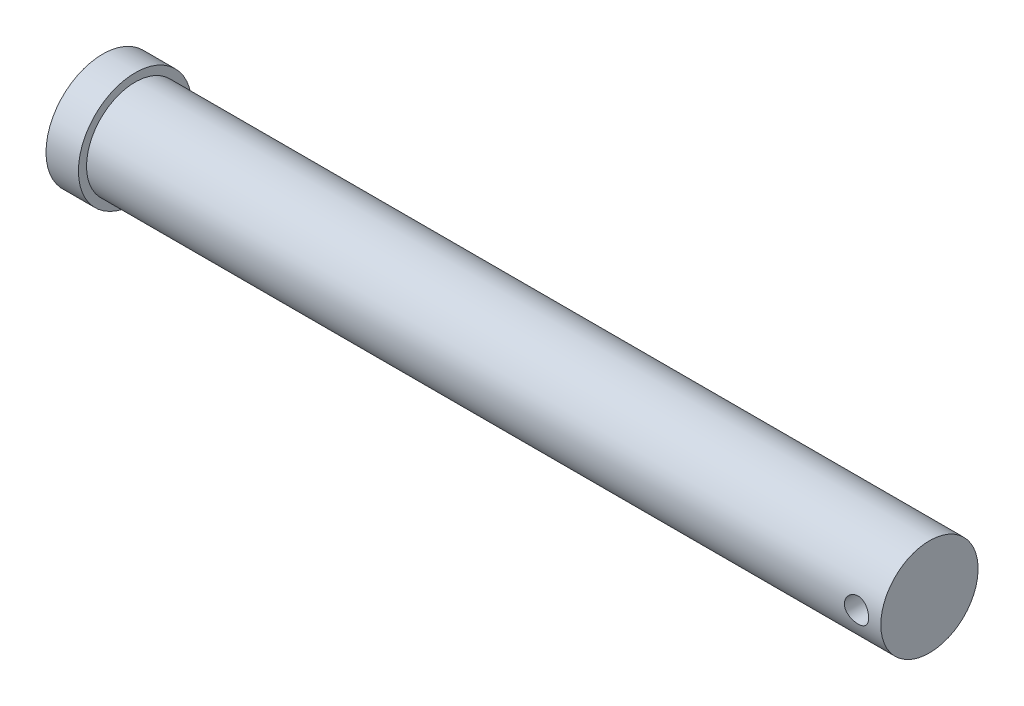
ISO-10303-21;
HEADER;
FILE_DESCRIPTION(('STEP AP214'),'2;1');
FILE_NAME('part.step','',(''),(''),'','','');
FILE_SCHEMA(('AUTOMOTIVE_DESIGN { 1 0 10303 214 1 1 1 1 }'));
ENDSEC;
DATA;
#1=APPLICATION_CONTEXT('core data for automotive mechanical design processes');
#2=APPLICATION_PROTOCOL_DEFINITION('international standard','automotive_design',2000,#1);
#3=PRODUCT_CONTEXT('',#1,'mechanical');
#4=PRODUCT('Part','Part','',(#3));
#5=PRODUCT_RELATED_PRODUCT_CATEGORY('part','',(#4));
#6=PRODUCT_DEFINITION_FORMATION('','',#4);
#7=PRODUCT_DEFINITION_CONTEXT('part definition',#1,'design');
#8=PRODUCT_DEFINITION('design','',#6,#7);
#9=PRODUCT_DEFINITION_SHAPE('','',#8);
#10=(LENGTH_UNIT() NAMED_UNIT(*) SI_UNIT(.MILLI.,.METRE.));
#11=(NAMED_UNIT(*) PLANE_ANGLE_UNIT() SI_UNIT($,.RADIAN.));
#12=(NAMED_UNIT(*) SI_UNIT($,.STERADIAN.) SOLID_ANGLE_UNIT());
#13=UNCERTAINTY_MEASURE_WITH_UNIT(LENGTH_MEASURE(1.E-05),#10,'distance_accuracy_value','');
#14=(GEOMETRIC_REPRESENTATION_CONTEXT(3) GLOBAL_UNCERTAINTY_ASSIGNED_CONTEXT((#13)) GLOBAL_UNIT_ASSIGNED_CONTEXT((#10,
#11,#12)) REPRESENTATION_CONTEXT('',''));
#15=CARTESIAN_POINT('',(0.,0.,0.));
#16=DIRECTION('',(0.,0.,1.));
#17=DIRECTION('',(1.,0.,0.));
#18=AXIS2_PLACEMENT_3D('',#15,#16,#17);
#19=CARTESIAN_POINT('',(0.,0.,0.));
#20=DIRECTION('',(1.,0.,0.));
#21=DIRECTION('',(0.,0.,-1.));
#22=AXIS2_PLACEMENT_3D('',#19,#20,#21);
#23=PLANE('',#22);
#24=CARTESIAN_POINT('',(0.,0.,0.));
#25=DIRECTION('',(-1.,0.,0.));
#26=DIRECTION('',(0.,0.,1.));
#27=AXIS2_PLACEMENT_3D('',#24,#25,#26);
#28=CIRCLE('',#27,35.);
#29=CARTESIAN_POINT('',(0.,0.,35.));
#30=VERTEX_POINT('',#29);
#31=EDGE_CURVE('E45',#30,#30,#28,.T.);
#32=ORIENTED_EDGE('',*,*,#31,.T.);
#33=EDGE_LOOP('',(#32));
#34=FACE_BOUND('',#33,.T.);
#35=ADVANCED_FACE('F31',(#34),#23,.F.);
#36=CARTESIAN_POINT('',(0.,0.,0.));
#37=DIRECTION('',(-1.,0.,0.));
#38=DIRECTION('',(0.,0.,1.));
#39=AXIS2_PLACEMENT_3D('',#36,#37,#38);
#40=CYLINDRICAL_SURFACE('',#39,35.);
#41=ORIENTED_EDGE('',*,*,#31,.F.);
#42=EDGE_LOOP('',(#41));
#43=FACE_BOUND('',#42,.T.);
#44=CARTESIAN_POINT('',(20.,0.,0.));
#45=DIRECTION('',(-1.,0.,0.));
#46=DIRECTION('',(0.,0.,1.));
#47=AXIS2_PLACEMENT_3D('',#44,#45,#46);
#48=CIRCLE('',#47,35.);
#49=CARTESIAN_POINT('',(20.,0.,35.));
#50=VERTEX_POINT('',#49);
#51=EDGE_CURVE('E49',#50,#50,#48,.T.);
#52=ORIENTED_EDGE('',*,*,#51,.T.);
#53=EDGE_LOOP('',(#52));
#54=FACE_BOUND('',#53,.T.);
#55=ADVANCED_FACE('F72',(#43,#54),#40,.T.);
#56=CARTESIAN_POINT('',(20.,35.,0.));
#57=DIRECTION('',(-1.,0.,0.));
#58=DIRECTION('',(0.,0.,1.));
#59=AXIS2_PLACEMENT_3D('',#56,#57,#58);
#60=PLANE('',#59);
#61=ORIENTED_EDGE('',*,*,#51,.F.);
#62=EDGE_LOOP('',(#61));
#63=FACE_BOUND('',#62,.T.);
#64=CARTESIAN_POINT('',(20.,0.,0.));
#65=DIRECTION('',(-1.,0.,0.));
#66=DIRECTION('',(0.,0.,1.));
#67=AXIS2_PLACEMENT_3D('',#64,#65,#66);
#68=CIRCLE('',#67,30.);
#69=CARTESIAN_POINT('',(20.,0.,30.));
#70=VERTEX_POINT('',#69);
#71=EDGE_CURVE('E83',#70,#70,#68,.T.);
#72=ORIENTED_EDGE('',*,*,#71,.T.);
#73=EDGE_LOOP('',(#72));
#74=FACE_BOUND('',#73,.T.);
#75=ADVANCED_FACE('F69',(#63,#74),#60,.F.);
#76=CARTESIAN_POINT('',(0.,0.,0.));
#77=DIRECTION('',(-1.,0.,0.));
#78=DIRECTION('',(0.,0.,1.));
#79=AXIS2_PLACEMENT_3D('',#76,#77,#78);
#80=CYLINDRICAL_SURFACE('',#79,30.);
#81=CARTESIAN_POINT('',(502.5,0.,-30.));
#82=CARTESIAN_POINT('',(502.500006186217,0.207256734254569,-30.0000037453459));
#83=CARTESIAN_POINT('',(502.491407656385,0.414445772619024,-29.9978490421554));
#84=CARTESIAN_POINT('',(502.457100172479,0.827372926875361,-29.9892986338407));
#85=CARTESIAN_POINT('',(502.431389266198,1.0331108745179,-29.9829024448411));
#86=CARTESIAN_POINT('',(502.36305535088,1.44164335288552,-29.9660390935064));
#87=CARTESIAN_POINT('',(502.320427095302,1.64443695024208,-29.9555706682773));
#88=CARTESIAN_POINT('',(502.218595090544,2.04566249050754,-29.9308482104685));
#89=CARTESIAN_POINT('',(502.159385232191,2.24409279672969,-29.9165927827403));
#90=CARTESIAN_POINT('',(502.024978510783,2.63482361033415,-29.8847130121074));
#91=CARTESIAN_POINT('',(501.949807291118,2.82713338772062,-29.8670940775137));
#92=CARTESIAN_POINT('',(501.783968260347,3.20473275040715,-29.8289408904844));
#93=CARTESIAN_POINT('',(501.693294723877,3.3900197110199,-29.8084055614329));
#94=CARTESIAN_POINT('',(501.497171832667,3.75222027556638,-29.7649811811595));
#95=CARTESIAN_POINT('',(501.391727896133,3.92913691827912,-29.742092993849));
#96=CARTESIAN_POINT('',(501.166735936979,4.27360568159018,-29.6945540671174));
#97=CARTESIAN_POINT('',(501.047182537647,4.44115419618479,-29.6699026572012));
#98=CARTESIAN_POINT('',(500.792523081933,4.76869838853694,-29.619039181262));
#99=CARTESIAN_POINT('',(500.657174907785,4.92850273427091,-29.5928069564233));
#100=CARTESIAN_POINT('',(500.373571351916,5.23627158512012,-29.5399027992388));
#101=CARTESIAN_POINT('',(500.225310108958,5.38423065457479,-29.5132306717209));
#102=CARTESIAN_POINT('',(499.916888160703,5.66727667516594,-29.4601886439759));
#103=CARTESIAN_POINT('',(499.756726097412,5.80236215327956,-29.4338187786372));
#104=CARTESIAN_POINT('',(499.425632772002,6.05867850940967,-29.3821290110363));
#105=CARTESIAN_POINT('',(499.254706399365,6.17991560837026,-29.3568086406046));
#106=CARTESIAN_POINT('',(498.900431237845,6.40951409930148,-29.3075439341613));
#107=CARTESIAN_POINT('',(498.716932176899,6.51764960185275,-29.2836266449605));
#108=CARTESIAN_POINT('',(498.341230118986,6.71799715274028,-29.2383150093389));
#109=CARTESIAN_POINT('',(498.149030545994,6.810215397515,-29.2169196821753));
#110=CARTESIAN_POINT('',(497.757145068966,6.97807998690051,-29.177283030045));
#111=CARTESIAN_POINT('',(497.557457135497,7.05372180053078,-29.1590425677113));
#112=CARTESIAN_POINT('',(497.152161449931,7.18774907819534,-29.1262944152227));
#113=CARTESIAN_POINT('',(496.946556194448,7.24614170611678,-29.111785175751));
#114=CARTESIAN_POINT('',(496.534958657447,7.34423429783442,-29.087191868454));
#115=CARTESIAN_POINT('',(496.329053396646,7.38427907774644,-29.0770264361312));
#116=CARTESIAN_POINT('',(495.914524296797,7.44698381998098,-29.0610302983691));
#117=CARTESIAN_POINT('',(495.705901540208,7.46965050140465,-29.0551979176174));
#118=CARTESIAN_POINT('',(495.287403528923,7.49742486553874,-29.0480434288025));
#119=CARTESIAN_POINT('',(495.077528217797,7.50253175108477,-29.0467215255021));
#120=CARTESIAN_POINT('',(494.658110384037,7.49513850303133,-29.0486301556068));
#121=CARTESIAN_POINT('',(494.448567856817,7.48263861425256,-29.0518606257116));
#122=CARTESIAN_POINT('',(494.036489209476,7.44066443989567,-29.062638653717));
#123=CARTESIAN_POINT('',(493.833907059313,7.41161271353984,-29.0700787116682));
#124=CARTESIAN_POINT('',(493.431905166734,7.33708950806219,-29.0889771849314));
#125=CARTESIAN_POINT('',(493.232486535232,7.29161238858812,-29.1004369805509));
#126=CARTESIAN_POINT('',(492.838319690164,7.18462456321617,-29.1270356051468));
#127=CARTESIAN_POINT('',(492.643570038699,7.12311886472073,-29.1421732850352));
#128=CARTESIAN_POINT('',(492.259908488116,6.98451980658922,-29.1757016001342));
#129=CARTESIAN_POINT('',(492.070998807608,6.90742060486369,-29.1940934541936));
#130=CARTESIAN_POINT('',(491.69851839304,6.73739848582145,-29.2338015327733));
#131=CARTESIAN_POINT('',(491.515017414975,6.64432902465882,-29.2551444484012));
#132=CARTESIAN_POINT('',(491.156419006921,6.4435338982084,-29.3000247863839));
#133=CARTESIAN_POINT('',(490.981324498637,6.33580318651128,-29.3235629634671));
#134=CARTESIAN_POINT('',(490.640714884194,6.10645448231129,-29.3721798477543));
#135=CARTESIAN_POINT('',(490.475199544114,5.98483682913724,-29.3972585173093));
#136=CARTESIAN_POINT('',(490.154773921606,5.72851464458553,-29.4482799478748));
#137=CARTESIAN_POINT('',(489.999863844413,5.59380986006427,-29.4742227255933));
#138=CARTESIAN_POINT('',(489.697330574703,5.30812720402326,-29.527029674638));
#139=CARTESIAN_POINT('',(489.550044476872,5.15679305825275,-29.5538989083984));
#140=CARTESIAN_POINT('',(489.268755446213,4.8422451377085,-29.6070614891839));
#141=CARTESIAN_POINT('',(489.134748122933,4.67903532063268,-29.6333550243011));
#142=CARTESIAN_POINT('',(488.88082948277,4.3416974590044,-29.6846555639648));
#143=CARTESIAN_POINT('',(488.760923905518,4.16756501268226,-29.7096620423464));
#144=CARTESIAN_POINT('',(488.536173056712,3.80966849400532,-29.7576713903058));
#145=CARTESIAN_POINT('',(488.431321967214,3.62590818010498,-29.7806750325378));
#146=CARTESIAN_POINT('',(488.237034272838,3.2492118412492,-29.8241295151946));
#147=CARTESIAN_POINT('',(488.147658542865,3.05624322556206,-29.8445701905708));
#148=CARTESIAN_POINT('',(487.985552498738,2.66321164273131,-29.8822063507743));
#149=CARTESIAN_POINT('',(487.912816015972,2.46315133653774,-29.8994030378182));
#150=CARTESIAN_POINT('',(487.784544100766,2.0573013366979,-29.9300671893901));
#151=CARTESIAN_POINT('',(487.729009232108,1.85151145550618,-29.9435345316877));
#152=CARTESIAN_POINT('',(487.635622134414,1.4357343464327,-29.9663479171876));
#153=CARTESIAN_POINT('',(487.597769469432,1.22574722216531,-29.9756940619961));
#154=CARTESIAN_POINT('',(487.540819163691,0.808578683807327,-29.9898089145492));
#155=CARTESIAN_POINT('',(487.521266127366,0.60146309569843,-29.9946886976466));
#156=CARTESIAN_POINT('',(487.499432162322,0.186267995157742,-30.0001400772457));
#157=CARTESIAN_POINT('',(487.497150960436,-0.0218115019769316,-30.000711741884));
#158=CARTESIAN_POINT('',(487.50987953381,-0.437389325214058,-29.9975310207239));
#159=CARTESIAN_POINT('',(487.524887864681,-0.644887698412771,-29.9937789961322));
#160=CARTESIAN_POINT('',(487.572063941794,-1.0578026849136,-29.9820565166686));
#161=CARTESIAN_POINT('',(487.604231620946,-1.26321930635197,-29.9740860782903));
#162=CARTESIAN_POINT('',(487.684842366611,-1.66742320422337,-29.9542990466074));
#163=CARTESIAN_POINT('',(487.733033584068,-1.86626371494319,-29.9425420528386));
#164=CARTESIAN_POINT('',(487.845432070167,-2.25918742632006,-29.9154620308896));
#165=CARTESIAN_POINT('',(487.909644760804,-2.45326899198188,-29.9001377955995));
#166=CARTESIAN_POINT('',(488.05356225007,-2.83525089394271,-29.8663374011303));
#167=CARTESIAN_POINT('',(488.133262697368,-3.02315294909718,-29.8478621274231));
#168=CARTESIAN_POINT('',(488.307610064188,-3.39167896910059,-29.8082350586212));
#169=CARTESIAN_POINT('',(488.402262583514,-3.57230017520983,-29.7870822613409));
#170=CARTESIAN_POINT('',(488.607595070583,-3.92811410360476,-29.7422701230095));
#171=CARTESIAN_POINT('',(488.718525064136,-4.10315786453241,-29.7185735994032));
#172=CARTESIAN_POINT('',(488.954405866344,-4.44338343365204,-29.6696123625192));
#173=CARTESIAN_POINT('',(489.07936153279,-4.60856179442648,-29.6443471072734));
#174=CARTESIAN_POINT('',(489.342420940197,-4.92794065130356,-29.5929310301235));
#175=CARTESIAN_POINT('',(489.480524460526,-5.08214133154534,-29.5667802230845));
#176=CARTESIAN_POINT('',(489.76898239741,-5.37858986672455,-29.5142920657744));
#177=CARTESIAN_POINT('',(489.919336952682,-5.52083758628273,-29.4879547133943));
#178=CARTESIAN_POINT('',(490.235205576479,-5.79583124003956,-29.4351563606738));
#179=CARTESIAN_POINT('',(490.401002867936,-5.92825459803294,-29.4087084526847));
#180=CARTESIAN_POINT('',(490.74329399094,-6.17862451598171,-29.3571275246933));
#181=CARTESIAN_POINT('',(490.919784122681,-6.29657604105008,-29.3319940554304));
#182=CARTESIAN_POINT('',(491.282397387657,-6.51724566861912,-29.2837544538572));
#183=CARTESIAN_POINT('',(491.468523885388,-6.61995840151202,-29.2606490373261));
#184=CARTESIAN_POINT('',(491.849007741884,-6.80928641924748,-29.2171705487862));
#185=CARTESIAN_POINT('',(492.043361767825,-6.89590814708459,-29.1967963840713));
#186=CARTESIAN_POINT('',(492.437897915295,-7.05197723932844,-29.1594928518965));
#187=CARTESIAN_POINT('',(492.638041174236,-7.12151832737368,-29.142544780169));
#188=CARTESIAN_POINT('',(493.043683954083,-7.24345651216673,-29.1124764442986));
#189=CARTESIAN_POINT('',(493.249181379846,-7.29586020933082,-29.0993547066657));
#190=CARTESIAN_POINT('',(493.664097517061,-7.38310953761375,-29.0773403452909));
#191=CARTESIAN_POINT('',(493.873516262,-7.41795501871779,-29.0684477576821));
#192=CARTESIAN_POINT('',(494.294693502206,-7.4697763239746,-29.0551744235845));
#193=CARTESIAN_POINT('',(494.506451941057,-7.48675257805301,-29.0507935685455));
#194=CARTESIAN_POINT('',(494.924548037895,-7.50245275501602,-29.0467427280978));
#195=CARTESIAN_POINT('',(495.130865291879,-7.50169050219213,-29.0469401256905));
#196=CARTESIAN_POINT('',(495.542757585411,-7.48317627143562,-29.0517153474307));
#197=CARTESIAN_POINT('',(495.748332344452,-7.46541843430732,-29.0562946822425));
#198=CARTESIAN_POINT('',(496.157102212016,-7.41306667528962,-29.0696950370366));
#199=CARTESIAN_POINT('',(496.360298223325,-7.3784793676475,-29.0785143906083));
#200=CARTESIAN_POINT('',(496.763027411306,-7.29274542738176,-29.1001342961677));
#201=CARTESIAN_POINT('',(496.962559195749,-7.24159263281373,-29.1129363295422));
#202=CARTESIAN_POINT('',(497.355248099114,-7.12352281554539,-29.1420502241293));
#203=CARTESIAN_POINT('',(497.548437627675,-7.05670785633585,-29.1583393045388));
#204=CARTESIAN_POINT('',(497.928538990651,-6.90762983393251,-29.1940151713161));
#205=CARTESIAN_POINT('',(498.115448654799,-6.82536149362091,-29.2134030155311));
#206=CARTESIAN_POINT('',(498.481700975957,-6.64600134575058,-29.2547283332099));
#207=CARTESIAN_POINT('',(498.66104416923,-6.54891059096665,-29.2766656255706));
#208=CARTESIAN_POINT('',(499.011053726098,-6.34057791264127,-29.3224903932774));
#209=CARTESIAN_POINT('',(499.181719851362,-6.22933560069453,-29.3463779221434));
#210=CARTESIAN_POINT('',(499.517676511658,-5.99034243964048,-29.3961065190916));
#211=CARTESIAN_POINT('',(499.682708134733,-5.8622347432516,-29.42198241748));
#212=CARTESIAN_POINT('',(500.001403053256,-5.5928073999301,-29.4743842744133));
#213=CARTESIAN_POINT('',(500.155069946792,-5.45149196693626,-29.5009100236431));
#214=CARTESIAN_POINT('',(500.450186022067,-5.15645532971087,-29.5539073425417));
#215=CARTESIAN_POINT('',(500.591628075764,-5.00272698747195,-29.580378871931));
#216=CARTESIAN_POINT('',(500.861210696173,-4.68398990056894,-29.6325210396486));
#217=CARTESIAN_POINT('',(500.989356069046,-4.51898526780466,-29.6581919649966));
#218=CARTESIAN_POINT('',(501.233778989682,-4.17555233782094,-29.7085076706245));
#219=CARTESIAN_POINT('',(501.349792570839,-3.99693193174415,-29.7331246154161));
#220=CARTESIAN_POINT('',(501.566283371818,-3.63032066972448,-29.7801093561847));
#221=CARTESIAN_POINT('',(501.666766303198,-3.44233329237775,-29.8024779779427));
#222=CARTESIAN_POINT('',(501.851436858964,-3.05829616105561,-29.8443309638024));
#223=CARTESIAN_POINT('',(501.935631507769,-2.86224992693626,-29.8638165703652));
#224=CARTESIAN_POINT('',(502.087082944362,-2.46348752288621,-29.8993536986122));
#225=CARTESIAN_POINT('',(502.154342287268,-2.26077236435601,-29.9154057382819));
#226=CARTESIAN_POINT('',(502.307791067383,-1.72222038090986,-29.9523811960307));
#227=CARTESIAN_POINT('',(502.379744222301,-1.38198934082171,-29.9701268439889));
#228=CARTESIAN_POINT('',(502.475841710173,-0.694441878055995,-29.9939326700618));
#229=CARTESIAN_POINT('',(502.499989638953,-0.347125990274112,-29.9999937270705));
#230=CARTESIAN_POINT('',(502.5,0.,-30.));
#231=B_SPLINE_CURVE_WITH_KNOTS('',3,(#81,#82,#83,#84,#85,#86,#87,#88,#89,#90,#91,#92,#93,#94,
#95,#96,#97,#98,#99,#100,#101,#102,#103,#104,#105,#106,#107,#108,#109,#110,#111,#112,#113,#114,
#115,#116,#117,#118,#119,#120,#121,#122,#123,#124,#125,#126,#127,#128,#129,#130,#131,#132,#133,
#134,#135,#136,#137,#138,#139,#140,#141,#142,#143,#144,#145,#146,#147,#148,#149,#150,#151,#152,
#153,#154,#155,#156,#157,#158,#159,#160,#161,#162,#163,#164,#165,#166,#167,#168,#169,#170,#171,
#172,#173,#174,#175,#176,#177,#178,#179,#180,#181,#182,#183,#184,#185,#186,#187,#188,#189,#190,
#191,#192,#193,#194,#195,#196,#197,#198,#199,#200,#201,#202,#203,#204,#205,#206,#207,#208,#209,
#210,#211,#212,#213,#214,#215,#216,#217,#218,#219,#220,#221,#222,#223,#224,#225,#226,#227,#228,
#229,#230),.UNSPECIFIED.,.T.,.F.,(4,2,2,2,2,2,2,2,2,2,2,2,2,2,2,2,2,2,2,2,2,2,2,2,2,2,2,2,2,2,2,
2,2,2,2,2,2,2,2,2,2,2,2,2,2,2,2,2,2,2,2,2,2,2,2,2,2,2,2,2,2,2,2,2,2,2,2,2,2,2,2,2,2,2,4),(0.,
0.621464317010411,1.24299954382041,1.86472767684073,2.48668517567917,3.10765090273788,
3.72884646419195,4.34981474719256,4.97102043224857,5.60345785394204,6.23618384989133,
6.86898215694607,7.50149507214967,8.14370490718983,8.7856641693503,9.42779868557194,
10.0696661359821,10.698918856558,11.3279281587941,11.9569660158718,12.5859951263176,
13.1996422302774,13.8135002565369,14.427166740115,15.0410635604955,15.6609283810618,
16.2810071015708,16.9010706736347,17.5211462419402,18.1590318968172,18.7967059344352,
19.4346386236678,20.0723241105669,20.7124637031903,21.3523655930573,21.992288453434,
22.6321955359512,23.2557181786968,23.8792309598842,24.5026916557758,25.1261499140132,
25.7402389224969,26.3545360338665,26.9686608054558,27.5830161248211,28.2080518295536,
28.8333046873217,29.4585470546529,30.083796502526,30.7245311303907,31.365045311475,
32.0057846536416,32.6462668819263,33.283151987456,33.9197915088557,34.5564364695178,
35.1930661124363,35.8112783348087,36.4297037614802,37.0478863332829,37.6662991180847,
38.2807888234881,38.8954887514424,39.5101450400982,40.1248182023234,40.7556352414594,
41.3862517005307,42.0172334122501,42.647986251688,43.2904290553216,43.9326350288527,
44.5745634267955,45.2163949154784,46.2573388715183,47.2982045265627),.UNSPECIFIED.);
#232=CARTESIAN_POINT('',(502.5,0.,-30.));
#233=VERTEX_POINT('',#232);
#234=EDGE_CURVE('E10',#233,#233,#231,.T.);
#235=ORIENTED_EDGE('',*,*,#234,.T.);
#236=EDGE_LOOP('',(#235));
#237=FACE_BOUND('',#236,.T.);
#238=CARTESIAN_POINT('',(502.5,0.,30.));
#239=CARTESIAN_POINT('',(502.500006186217,-0.207256734254569,30.0000037453459));
#240=CARTESIAN_POINT('',(502.491407656385,-0.414445772619024,29.9978490421554));
#241=CARTESIAN_POINT('',(502.457100172479,-0.827372926875361,29.9892986338407));
#242=CARTESIAN_POINT('',(502.431389266198,-1.0331108745179,29.9829024448411));
#243=CARTESIAN_POINT('',(502.36305535088,-1.44164335288552,29.9660390935064));
#244=CARTESIAN_POINT('',(502.320427095302,-1.64443695024208,29.9555706682773));
#245=CARTESIAN_POINT('',(502.218595090544,-2.04566249050754,29.9308482104685));
#246=CARTESIAN_POINT('',(502.159385232191,-2.24409279672969,29.9165927827403));
#247=CARTESIAN_POINT('',(502.024978510783,-2.63482361033415,29.8847130121074));
#248=CARTESIAN_POINT('',(501.949807291118,-2.82713338772062,29.8670940775137));
#249=CARTESIAN_POINT('',(501.783968260347,-3.20473275040715,29.8289408904844));
#250=CARTESIAN_POINT('',(501.693294723877,-3.3900197110199,29.8084055614329));
#251=CARTESIAN_POINT('',(501.497171832667,-3.75222027556638,29.7649811811595));
#252=CARTESIAN_POINT('',(501.391727896133,-3.92913691827912,29.742092993849));
#253=CARTESIAN_POINT('',(501.166735936979,-4.27360568159018,29.6945540671174));
#254=CARTESIAN_POINT('',(501.047182537647,-4.44115419618479,29.6699026572012));
#255=CARTESIAN_POINT('',(500.792523081933,-4.76869838853694,29.619039181262));
#256=CARTESIAN_POINT('',(500.657174907785,-4.92850273427091,29.5928069564233));
#257=CARTESIAN_POINT('',(500.373571351916,-5.23627158512012,29.5399027992388));
#258=CARTESIAN_POINT('',(500.225310108958,-5.38423065457479,29.5132306717209));
#259=CARTESIAN_POINT('',(499.916888160703,-5.66727667516594,29.4601886439759));
#260=CARTESIAN_POINT('',(499.756726097412,-5.80236215327956,29.4338187786372));
#261=CARTESIAN_POINT('',(499.425632772002,-6.05867850940967,29.3821290110363));
#262=CARTESIAN_POINT('',(499.254706399365,-6.17991560837026,29.3568086406046));
#263=CARTESIAN_POINT('',(498.900431237845,-6.40951409930148,29.3075439341613));
#264=CARTESIAN_POINT('',(498.716932176899,-6.51764960185275,29.2836266449605));
#265=CARTESIAN_POINT('',(498.341230118986,-6.71799715274028,29.2383150093389));
#266=CARTESIAN_POINT('',(498.149030545994,-6.810215397515,29.2169196821753));
#267=CARTESIAN_POINT('',(497.757145068966,-6.97807998690051,29.177283030045));
#268=CARTESIAN_POINT('',(497.557457135497,-7.05372180053078,29.1590425677113));
#269=CARTESIAN_POINT('',(497.152161449931,-7.18774907819534,29.1262944152227));
#270=CARTESIAN_POINT('',(496.946556194448,-7.24614170611678,29.111785175751));
#271=CARTESIAN_POINT('',(496.534958657447,-7.34423429783442,29.087191868454));
#272=CARTESIAN_POINT('',(496.329053396646,-7.38427907774644,29.0770264361312));
#273=CARTESIAN_POINT('',(495.914524296797,-7.44698381998098,29.0610302983691));
#274=CARTESIAN_POINT('',(495.705901540208,-7.46965050140465,29.0551979176174));
#275=CARTESIAN_POINT('',(495.287403528923,-7.49742486553874,29.0480434288025));
#276=CARTESIAN_POINT('',(495.077528217797,-7.50253175108477,29.0467215255021));
#277=CARTESIAN_POINT('',(494.658110384037,-7.49513850303133,29.0486301556068));
#278=CARTESIAN_POINT('',(494.448567856817,-7.48263861425256,29.0518606257116));
#279=CARTESIAN_POINT('',(494.036489209476,-7.44066443989567,29.062638653717));
#280=CARTESIAN_POINT('',(493.833907059313,-7.41161271353984,29.0700787116682));
#281=CARTESIAN_POINT('',(493.431905166734,-7.33708950806219,29.0889771849314));
#282=CARTESIAN_POINT('',(493.232486535232,-7.29161238858812,29.1004369805509));
#283=CARTESIAN_POINT('',(492.838319690164,-7.18462456321617,29.1270356051468));
#284=CARTESIAN_POINT('',(492.643570038699,-7.12311886472073,29.1421732850352));
#285=CARTESIAN_POINT('',(492.259908488116,-6.98451980658922,29.1757016001342));
#286=CARTESIAN_POINT('',(492.070998807608,-6.90742060486369,29.1940934541936));
#287=CARTESIAN_POINT('',(491.69851839304,-6.73739848582145,29.2338015327733));
#288=CARTESIAN_POINT('',(491.515017414975,-6.64432902465882,29.2551444484012));
#289=CARTESIAN_POINT('',(491.156419006921,-6.4435338982084,29.3000247863839));
#290=CARTESIAN_POINT('',(490.981324498637,-6.33580318651128,29.3235629634671));
#291=CARTESIAN_POINT('',(490.640714884194,-6.10645448231129,29.3721798477543));
#292=CARTESIAN_POINT('',(490.475199544114,-5.98483682913724,29.3972585173093));
#293=CARTESIAN_POINT('',(490.154773921606,-5.72851464458553,29.4482799478748));
#294=CARTESIAN_POINT('',(489.999863844413,-5.59380986006427,29.4742227255933));
#295=CARTESIAN_POINT('',(489.697330574703,-5.30812720402326,29.527029674638));
#296=CARTESIAN_POINT('',(489.550044476872,-5.15679305825275,29.5538989083984));
#297=CARTESIAN_POINT('',(489.268755446213,-4.8422451377085,29.6070614891839));
#298=CARTESIAN_POINT('',(489.134748122933,-4.67903532063268,29.6333550243011));
#299=CARTESIAN_POINT('',(488.88082948277,-4.3416974590044,29.6846555639648));
#300=CARTESIAN_POINT('',(488.760923905518,-4.16756501268226,29.7096620423464));
#301=CARTESIAN_POINT('',(488.536173056712,-3.80966849400532,29.7576713903058));
#302=CARTESIAN_POINT('',(488.431321967214,-3.62590818010498,29.7806750325378));
#303=CARTESIAN_POINT('',(488.237034272838,-3.2492118412492,29.8241295151946));
#304=CARTESIAN_POINT('',(488.147658542865,-3.05624322556206,29.8445701905708));
#305=CARTESIAN_POINT('',(487.985552498738,-2.66321164273131,29.8822063507743));
#306=CARTESIAN_POINT('',(487.912816015972,-2.46315133653774,29.8994030378182));
#307=CARTESIAN_POINT('',(487.784544100766,-2.0573013366979,29.9300671893901));
#308=CARTESIAN_POINT('',(487.729009232108,-1.85151145550618,29.9435345316877));
#309=CARTESIAN_POINT('',(487.635622134414,-1.4357343464327,29.9663479171876));
#310=CARTESIAN_POINT('',(487.597769469432,-1.22574722216531,29.9756940619961));
#311=CARTESIAN_POINT('',(487.540819163691,-0.808578683807327,29.9898089145492));
#312=CARTESIAN_POINT('',(487.521266127366,-0.60146309569843,29.9946886976466));
#313=CARTESIAN_POINT('',(487.499432162322,-0.186267995157742,30.0001400772457));
#314=CARTESIAN_POINT('',(487.497150960436,0.0218115019769316,30.000711741884));
#315=CARTESIAN_POINT('',(487.50987953381,0.437389325214058,29.9975310207239));
#316=CARTESIAN_POINT('',(487.524887864681,0.644887698412771,29.9937789961322));
#317=CARTESIAN_POINT('',(487.572063941794,1.0578026849136,29.9820565166686));
#318=CARTESIAN_POINT('',(487.604231620946,1.26321930635197,29.9740860782903));
#319=CARTESIAN_POINT('',(487.684842366611,1.66742320422337,29.9542990466074));
#320=CARTESIAN_POINT('',(487.733033584068,1.86626371494319,29.9425420528386));
#321=CARTESIAN_POINT('',(487.845432070167,2.25918742632006,29.9154620308896));
#322=CARTESIAN_POINT('',(487.909644760804,2.45326899198188,29.9001377955995));
#323=CARTESIAN_POINT('',(488.05356225007,2.83525089394271,29.8663374011303));
#324=CARTESIAN_POINT('',(488.133262697368,3.02315294909718,29.8478621274231));
#325=CARTESIAN_POINT('',(488.307610064188,3.39167896910059,29.8082350586212));
#326=CARTESIAN_POINT('',(488.402262583514,3.57230017520983,29.7870822613409));
#327=CARTESIAN_POINT('',(488.607595070583,3.92811410360476,29.7422701230095));
#328=CARTESIAN_POINT('',(488.718525064136,4.10315786453241,29.7185735994032));
#329=CARTESIAN_POINT('',(488.954405866344,4.44338343365204,29.6696123625192));
#330=CARTESIAN_POINT('',(489.07936153279,4.60856179442648,29.6443471072734));
#331=CARTESIAN_POINT('',(489.342420940197,4.92794065130356,29.5929310301235));
#332=CARTESIAN_POINT('',(489.480524460526,5.08214133154534,29.5667802230845));
#333=CARTESIAN_POINT('',(489.76898239741,5.37858986672455,29.5142920657744));
#334=CARTESIAN_POINT('',(489.919336952682,5.52083758628273,29.4879547133943));
#335=CARTESIAN_POINT('',(490.235205576479,5.79583124003956,29.4351563606738));
#336=CARTESIAN_POINT('',(490.401002867936,5.92825459803294,29.4087084526847));
#337=CARTESIAN_POINT('',(490.74329399094,6.17862451598171,29.3571275246933));
#338=CARTESIAN_POINT('',(490.919784122681,6.29657604105008,29.3319940554304));
#339=CARTESIAN_POINT('',(491.282397387657,6.51724566861912,29.2837544538572));
#340=CARTESIAN_POINT('',(491.468523885388,6.61995840151202,29.2606490373261));
#341=CARTESIAN_POINT('',(491.849007741884,6.80928641924748,29.2171705487862));
#342=CARTESIAN_POINT('',(492.043361767825,6.89590814708459,29.1967963840713));
#343=CARTESIAN_POINT('',(492.437897915295,7.05197723932844,29.1594928518965));
#344=CARTESIAN_POINT('',(492.638041174236,7.12151832737368,29.142544780169));
#345=CARTESIAN_POINT('',(493.043683954083,7.24345651216673,29.1124764442986));
#346=CARTESIAN_POINT('',(493.249181379846,7.29586020933082,29.0993547066657));
#347=CARTESIAN_POINT('',(493.664097517061,7.38310953761375,29.0773403452909));
#348=CARTESIAN_POINT('',(493.873516262,7.41795501871779,29.0684477576821));
#349=CARTESIAN_POINT('',(494.294693502206,7.4697763239746,29.0551744235845));
#350=CARTESIAN_POINT('',(494.506451941057,7.48675257805301,29.0507935685455));
#351=CARTESIAN_POINT('',(494.924548037895,7.50245275501602,29.0467427280978));
#352=CARTESIAN_POINT('',(495.130865291879,7.50169050219213,29.0469401256905));
#353=CARTESIAN_POINT('',(495.542757585411,7.48317627143562,29.0517153474307));
#354=CARTESIAN_POINT('',(495.748332344452,7.46541843430732,29.0562946822425));
#355=CARTESIAN_POINT('',(496.157102212016,7.41306667528962,29.0696950370366));
#356=CARTESIAN_POINT('',(496.360298223325,7.3784793676475,29.0785143906083));
#357=CARTESIAN_POINT('',(496.763027411306,7.29274542738176,29.1001342961677));
#358=CARTESIAN_POINT('',(496.962559195749,7.24159263281373,29.1129363295422));
#359=CARTESIAN_POINT('',(497.355248099114,7.12352281554539,29.1420502241293));
#360=CARTESIAN_POINT('',(497.548437627675,7.05670785633585,29.1583393045388));
#361=CARTESIAN_POINT('',(497.928538990651,6.90762983393251,29.1940151713161));
#362=CARTESIAN_POINT('',(498.115448654799,6.82536149362091,29.2134030155311));
#363=CARTESIAN_POINT('',(498.481700975957,6.64600134575058,29.2547283332099));
#364=CARTESIAN_POINT('',(498.66104416923,6.54891059096665,29.2766656255706));
#365=CARTESIAN_POINT('',(499.011053726098,6.34057791264127,29.3224903932774));
#366=CARTESIAN_POINT('',(499.181719851362,6.22933560069453,29.3463779221434));
#367=CARTESIAN_POINT('',(499.517676511658,5.99034243964048,29.3961065190916));
#368=CARTESIAN_POINT('',(499.682708134733,5.8622347432516,29.42198241748));
#369=CARTESIAN_POINT('',(500.001403053256,5.5928073999301,29.4743842744133));
#370=CARTESIAN_POINT('',(500.155069946792,5.45149196693626,29.5009100236431));
#371=CARTESIAN_POINT('',(500.450186022067,5.15645532971087,29.5539073425417));
#372=CARTESIAN_POINT('',(500.591628075764,5.00272698747195,29.580378871931));
#373=CARTESIAN_POINT('',(500.861210696173,4.68398990056894,29.6325210396486));
#374=CARTESIAN_POINT('',(500.989356069046,4.51898526780466,29.6581919649966));
#375=CARTESIAN_POINT('',(501.233778989682,4.17555233782094,29.7085076706245));
#376=CARTESIAN_POINT('',(501.349792570839,3.99693193174415,29.7331246154161));
#377=CARTESIAN_POINT('',(501.566283371818,3.63032066972448,29.7801093561847));
#378=CARTESIAN_POINT('',(501.666766303198,3.44233329237775,29.8024779779427));
#379=CARTESIAN_POINT('',(501.851436858964,3.05829616105561,29.8443309638024));
#380=CARTESIAN_POINT('',(501.935631507769,2.86224992693626,29.8638165703652));
#381=CARTESIAN_POINT('',(502.087082944362,2.46348752288621,29.8993536986122));
#382=CARTESIAN_POINT('',(502.154342287268,2.26077236435601,29.9154057382819));
#383=CARTESIAN_POINT('',(502.307791067383,1.72222038090986,29.9523811960307));
#384=CARTESIAN_POINT('',(502.379744222301,1.38198934082171,29.9701268439889));
#385=CARTESIAN_POINT('',(502.475841710173,0.694441878055995,29.9939326700618));
#386=CARTESIAN_POINT('',(502.499989638953,0.347125990274112,29.9999937270705));
#387=CARTESIAN_POINT('',(502.5,0.,30.));
#388=B_SPLINE_CURVE_WITH_KNOTS('',3,(#238,#239,#240,#241,#242,#243,#244,#245,#246,#247,#248,
#249,#250,#251,#252,#253,#254,#255,#256,#257,#258,#259,#260,#261,#262,#263,#264,#265,#266,#267,
#268,#269,#270,#271,#272,#273,#274,#275,#276,#277,#278,#279,#280,#281,#282,#283,#284,#285,#286,
#287,#288,#289,#290,#291,#292,#293,#294,#295,#296,#297,#298,#299,#300,#301,#302,#303,#304,#305,
#306,#307,#308,#309,#310,#311,#312,#313,#314,#315,#316,#317,#318,#319,#320,#321,#322,#323,#324,
#325,#326,#327,#328,#329,#330,#331,#332,#333,#334,#335,#336,#337,#338,#339,#340,#341,#342,#343,
#344,#345,#346,#347,#348,#349,#350,#351,#352,#353,#354,#355,#356,#357,#358,#359,#360,#361,#362,
#363,#364,#365,#366,#367,#368,#369,#370,#371,#372,#373,#374,#375,#376,#377,#378,#379,#380,#381,
#382,#383,#384,#385,#386,#387),.UNSPECIFIED.,.T.,.F.,(4,2,2,2,2,2,2,2,2,2,2,2,2,2,2,2,2,2,2,2,2,
2,2,2,2,2,2,2,2,2,2,2,2,2,2,2,2,2,2,2,2,2,2,2,2,2,2,2,2,2,2,2,2,2,2,2,2,2,2,2,2,2,2,2,2,2,2,2,2,
2,2,2,2,2,4),(0.,0.621464317010411,1.24299954382041,1.86472767684073,2.48668517567917,
3.10765090273788,3.72884646419195,4.34981474719256,4.97102043224857,5.60345785394204,
6.23618384989133,6.86898215694607,7.50149507214967,8.14370490718983,8.7856641693503,
9.42779868557194,10.0696661359821,10.698918856558,11.3279281587941,11.9569660158718,
12.5859951263176,13.1996422302774,13.8135002565369,14.427166740115,15.0410635604955,
15.6609283810618,16.2810071015708,16.9010706736347,17.5211462419402,18.1590318968172,
18.7967059344352,19.4346386236678,20.0723241105669,20.7124637031903,21.3523655930573,
21.992288453434,22.6321955359512,23.2557181786968,23.8792309598842,24.5026916557758,
25.1261499140132,25.7402389224969,26.3545360338665,26.9686608054558,27.5830161248211,
28.2080518295536,28.8333046873217,29.4585470546529,30.083796502526,30.7245311303907,
31.365045311475,32.0057846536416,32.6462668819263,33.283151987456,33.9197915088557,
34.5564364695178,35.1930661124363,35.8112783348087,36.4297037614802,37.0478863332829,
37.6662991180847,38.2807888234881,38.8954887514424,39.5101450400982,40.1248182023234,
40.7556352414594,41.3862517005307,42.0172334122501,42.647986251688,43.2904290553216,
43.9326350288527,44.5745634267955,45.2163949154784,46.2573388715183,47.2982045265627),.UNSPECIFIED.);
#389=CARTESIAN_POINT('',(502.5,0.,30.));
#390=VERTEX_POINT('',#389);
#391=EDGE_CURVE('E41',#390,#390,#388,.T.);
#392=ORIENTED_EDGE('',*,*,#391,.T.);
#393=EDGE_LOOP('',(#392));
#394=FACE_BOUND('',#393,.T.);
#395=ORIENTED_EDGE('',*,*,#71,.F.);
#396=EDGE_LOOP('',(#395));
#397=FACE_BOUND('',#396,.T.);
#398=CARTESIAN_POINT('',(510.,0.,0.));
#399=DIRECTION('',(-1.,0.,0.));
#400=DIRECTION('',(0.,0.,1.));
#401=AXIS2_PLACEMENT_3D('',#398,#399,#400);
#402=CIRCLE('',#401,30.);
#403=CARTESIAN_POINT('',(510.,0.,30.));
#404=VERTEX_POINT('',#403);
#405=EDGE_CURVE('E85',#404,#404,#402,.T.);
#406=ORIENTED_EDGE('',*,*,#405,.T.);
#407=EDGE_LOOP('',(#406));
#408=FACE_BOUND('',#407,.T.);
#409=ADVANCED_FACE('F54',(#237,#394,#397,#408),#80,.T.);
#410=CARTESIAN_POINT('',(510.,30.,0.));
#411=DIRECTION('',(-1.,0.,0.));
#412=DIRECTION('',(0.,0.,1.));
#413=AXIS2_PLACEMENT_3D('',#410,#411,#412);
#414=PLANE('',#413);
#415=ORIENTED_EDGE('',*,*,#405,.F.);
#416=EDGE_LOOP('',(#415));
#417=FACE_BOUND('',#416,.T.);
#418=ADVANCED_FACE('F61',(#417),#414,.F.);
#419=CARTESIAN_POINT('',(495.,0.,-30.));
#420=DIRECTION('',(0.,0.,1.));
#421=DIRECTION('',(1.,0.,0.));
#422=AXIS2_PLACEMENT_3D('',#419,#420,#421);
#423=CYLINDRICAL_SURFACE('',#422,7.49999999999996);
#424=ORIENTED_EDGE('',*,*,#391,.F.);
#425=EDGE_LOOP('',(#424));
#426=FACE_BOUND('',#425,.T.);
#427=ORIENTED_EDGE('',*,*,#234,.F.);
#428=EDGE_LOOP('',(#427));
#429=FACE_BOUND('',#428,.T.);
#430=ADVANCED_FACE('F58',(#426,#429),#423,.F.);
#431=CLOSED_SHELL('',(#35,#55,#75,#409,#418,#430));
#432=MANIFOLD_SOLID_BREP('B2',#431);
#433=ADVANCED_BREP_SHAPE_REPRESENTATION('',(#18,#432),#14);
#434=SHAPE_DEFINITION_REPRESENTATION(#9,#433);
ENDSEC;
END-ISO-10303-21;
